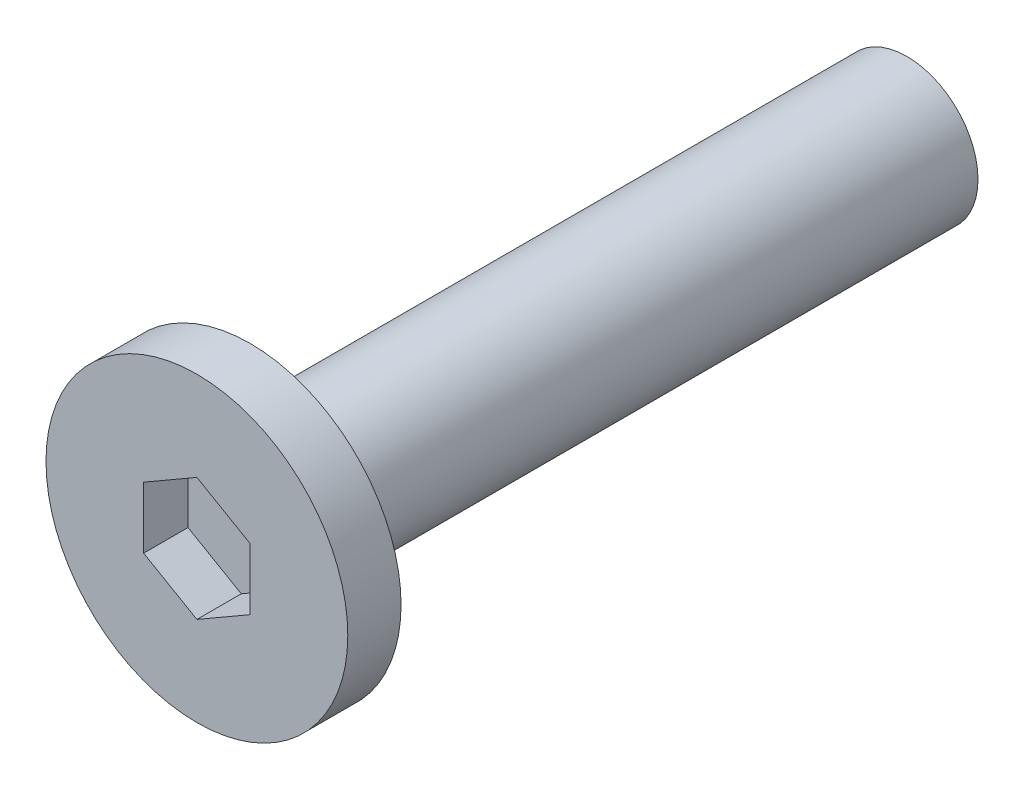
ISO-10303-21;
HEADER;
FILE_DESCRIPTION(('STEP AP214'),'2;1');
FILE_NAME('part.step','',(''),(''),'','','');
FILE_SCHEMA(('AUTOMOTIVE_DESIGN { 1 0 10303 214 1 1 1 1 }'));
ENDSEC;
DATA;
#1=APPLICATION_CONTEXT('core data for automotive mechanical design processes');
#2=APPLICATION_PROTOCOL_DEFINITION('international standard','automotive_design',2000,#1);
#3=PRODUCT_CONTEXT('',#1,'mechanical');
#4=PRODUCT('Part','Part','',(#3));
#5=PRODUCT_RELATED_PRODUCT_CATEGORY('part','',(#4));
#6=PRODUCT_DEFINITION_FORMATION('','',#4);
#7=PRODUCT_DEFINITION_CONTEXT('part definition',#1,'design');
#8=PRODUCT_DEFINITION('design','',#6,#7);
#9=PRODUCT_DEFINITION_SHAPE('','',#8);
#10=(LENGTH_UNIT() NAMED_UNIT(*) SI_UNIT(.MILLI.,.METRE.));
#11=(NAMED_UNIT(*) PLANE_ANGLE_UNIT() SI_UNIT($,.RADIAN.));
#12=(NAMED_UNIT(*) SI_UNIT($,.STERADIAN.) SOLID_ANGLE_UNIT());
#13=UNCERTAINTY_MEASURE_WITH_UNIT(LENGTH_MEASURE(1.E-05),#10,'distance_accuracy_value','');
#14=(GEOMETRIC_REPRESENTATION_CONTEXT(3) GLOBAL_UNCERTAINTY_ASSIGNED_CONTEXT((#13)) GLOBAL_UNIT_ASSIGNED_CONTEXT((#10,
#11,#12)) REPRESENTATION_CONTEXT('',''));
#15=CARTESIAN_POINT('',(0.,0.,0.));
#16=DIRECTION('',(0.,0.,1.));
#17=DIRECTION('',(1.,0.,0.));
#18=AXIS2_PLACEMENT_3D('',#15,#16,#17);
#19=CARTESIAN_POINT('',(86.6025403784436,-143.95,369.174757541019));
#20=DIRECTION('',(0.,0.,1.));
#21=DIRECTION('',(1.,0.,0.));
#22=AXIS2_PLACEMENT_3D('',#19,#20,#21);
#23=PLANE('',#22);
#24=CARTESIAN_POINT('',(86.6025403784436,-143.95,369.174757541019));
#25=DIRECTION('',(0.,0.,1.));
#26=DIRECTION('',(-1.,0.,0.));
#27=AXIS2_PLACEMENT_3D('',#24,#25,#26);
#28=CIRCLE('',#27,1.5);
#29=CARTESIAN_POINT('',(85.1025403784436,-143.95,369.174757541019));
#30=VERTEX_POINT('',#29);
#31=EDGE_CURVE('E11',#30,#30,#28,.T.);
#32=ORIENTED_EDGE('',*,*,#31,.F.);
#33=EDGE_LOOP('',(#32));
#34=FACE_BOUND('',#33,.T.);
#35=ADVANCED_FACE('F42',(#34),#23,.F.);
#36=CARTESIAN_POINT('',(86.6025403784436,-143.95,351.774757541019));
#37=DIRECTION('',(0.,0.,1.));
#38=DIRECTION('',(1.,0.,0.));
#39=AXIS2_PLACEMENT_3D('',#36,#37,#38);
#40=CYLINDRICAL_SURFACE('',#39,1.5);
#41=ORIENTED_EDGE('',*,*,#31,.T.);
#42=EDGE_LOOP('',(#41));
#43=FACE_BOUND('',#42,.T.);
#44=CARTESIAN_POINT('',(86.6025403784436,-143.95,351.474757541019));
#45=DIRECTION('',(0.,0.,1.));
#46=DIRECTION('',(1.,0.,0.));
#47=AXIS2_PLACEMENT_3D('',#44,#45,#46);
#48=CIRCLE('',#47,1.5);
#49=CARTESIAN_POINT('',(88.1025403784436,-143.95,351.474757541019));
#50=VERTEX_POINT('',#49);
#51=EDGE_CURVE('E53',#50,#50,#48,.T.);
#52=ORIENTED_EDGE('',*,*,#51,.F.);
#53=EDGE_LOOP('',(#52));
#54=FACE_BOUND('',#53,.T.);
#55=ADVANCED_FACE('F250',(#43,#54),#40,.F.);
#56=CARTESIAN_POINT('',(86.6025403784436,-143.95,351.474757541019));
#57=DIRECTION('',(0.,0.,-1.));
#58=DIRECTION('',(0.,-1.,0.));
#59=AXIS2_PLACEMENT_3D('',#56,#57,#58);
#60=PLANE('',#59);
#61=CARTESIAN_POINT('',(86.6025403784436,-143.95,351.474757541019));
#62=DIRECTION('',(0.,0.,1.));
#63=DIRECTION('',(1.,0.,0.));
#64=AXIS2_PLACEMENT_3D('',#61,#62,#63);
#65=CIRCLE('',#64,2.);
#66=CARTESIAN_POINT('',(88.6025403784436,-143.95,351.474757541019));
#67=VERTEX_POINT('',#66);
#68=EDGE_CURVE('E139',#67,#67,#65,.T.);
#69=ORIENTED_EDGE('',*,*,#68,.F.);
#70=EDGE_LOOP('',(#69));
#71=FACE_BOUND('',#70,.T.);
#72=ORIENTED_EDGE('',*,*,#51,.T.);
#73=EDGE_LOOP('',(#72));
#74=FACE_BOUND('',#73,.T.);
#75=ADVANCED_FACE('F255',(#71,#74),#60,.T.);
#76=CARTESIAN_POINT('',(-12.990381056767,-121.450000000002,370.224757541019));
#77=DIRECTION('',(0.,0.,1.));
#78=DIRECTION('',(1.,0.,0.));
#79=AXIS2_PLACEMENT_3D('',#76,#77,#78);
#80=PLANE('',#79);
#81=DIRECTION('',(0.866025403784439,0.5,0.));
#82=VECTOR('',#81,1.);
#83=CARTESIAN_POINT('',(20.9006350946104,-180.150961894325,370.224757541019));
#84=LINE('',#83,#82);
#85=CARTESIAN_POINT('',(85.1025403784435,-143.083974596217,370.224757541019));
#86=VERTEX_POINT('',#85);
#87=CARTESIAN_POINT('',(86.6025403784436,-142.217949192433,370.224757541019));
#88=VERTEX_POINT('',#87);
#89=EDGE_CURVE('E191',#86,#88,#84,.T.);
#90=ORIENTED_EDGE('',*,*,#89,.F.);
#91=DIRECTION('',(0.,1.,0.));
#92=VECTOR('',#91,1.);
#93=CARTESIAN_POINT('',(85.1025403784435,-121.450000000002,370.224757541019));
#94=LINE('',#93,#92);
#95=CARTESIAN_POINT('',(85.1025403784435,-144.816025403786,370.224757541019));
#96=VERTEX_POINT('',#95);
#97=EDGE_CURVE('E185',#96,#86,#94,.T.);
#98=ORIENTED_EDGE('',*,*,#97,.F.);
#99=DIRECTION('',(-0.866025403784439,0.5,0.));
#100=VECTOR('',#99,1.);
#101=CARTESIAN_POINT('',(1.41506350946074,-96.4990381056784,370.224757541019));
#102=LINE('',#101,#100);
#103=CARTESIAN_POINT('',(86.6025403784436,-145.682050807571,370.224757541019));
#104=VERTEX_POINT('',#103);
#105=EDGE_CURVE('E167',#104,#96,#102,.T.);
#106=ORIENTED_EDGE('',*,*,#105,.F.);
#107=DIRECTION('',(-0.866025403784439,-0.5,0.));
#108=VECTOR('',#107,1.);
#109=CARTESIAN_POINT('',(22.4006350946105,-182.749038105679,370.224757541019));
#110=LINE('',#109,#108);
#111=CARTESIAN_POINT('',(88.1025403784436,-144.816025403786,370.224757541019));
#112=VERTEX_POINT('',#111);
#113=EDGE_CURVE('E148',#112,#104,#110,.T.);
#114=ORIENTED_EDGE('',*,*,#113,.F.);
#115=DIRECTION('',(0.,-1.,0.));
#116=VECTOR('',#115,1.);
#117=CARTESIAN_POINT('',(88.1025403784436,-121.450000000002,370.224757541019));
#118=LINE('',#117,#116);
#119=CARTESIAN_POINT('',(88.1025403784436,-143.083974596217,370.224757541019));
#120=VERTEX_POINT('',#119);
#121=EDGE_CURVE('E147',#120,#112,#118,.T.);
#122=ORIENTED_EDGE('',*,*,#121,.F.);
#123=DIRECTION('',(0.866025403784439,-0.5,0.));
#124=VECTOR('',#123,1.);
#125=CARTESIAN_POINT('',(2.91506350946067,-93.9009618943254,370.224757541019));
#126=LINE('',#125,#124);
#127=EDGE_CURVE('E154',#88,#120,#126,.T.);
#128=ORIENTED_EDGE('',*,*,#127,.F.);
#129=EDGE_LOOP('',(#90,#98,#106,#114,#122,#128));
#130=FACE_BOUND('',#129,.T.);
#131=ADVANCED_FACE('F237',(#130),#80,.T.);
#132=CARTESIAN_POINT('',(87.9775403784436,-143.011805812569,369.974757541019));
#133=DIRECTION('',(0.5,0.866025403784439,0.));
#134=DIRECTION('',(0.,0.,-1.));
#135=AXIS2_PLACEMENT_3D('',#132,#133,#134);
#136=PLANE('',#135);
#137=DIRECTION('',(-0.866025403784439,0.5,0.));
#138=VECTOR('',#137,1.);
#139=CARTESIAN_POINT('',(87.9775403784436,-143.011805812569,371.474757541018));
#140=LINE('',#139,#138);
#141=CARTESIAN_POINT('',(88.1025403784436,-143.083974596217,371.474757541018));
#142=VERTEX_POINT('',#141);
#143=CARTESIAN_POINT('',(86.6025403784436,-142.217949192433,371.474757541018));
#144=VERTEX_POINT('',#143);
#145=EDGE_CURVE('E46',#142,#144,#140,.T.);
#146=ORIENTED_EDGE('',*,*,#145,.T.);
#147=DIRECTION('',(0.,0.,-1.));
#148=VECTOR('',#147,1.);
#149=CARTESIAN_POINT('',(86.6025403784436,-142.217949192433,369.974757541019));
#150=LINE('',#149,#148);
#151=EDGE_CURVE('E186',#144,#88,#150,.T.);
#152=ORIENTED_EDGE('',*,*,#151,.T.);
#153=ORIENTED_EDGE('',*,*,#127,.T.);
#154=DIRECTION('',(0.,0.,-1.));
#155=VECTOR('',#154,1.);
#156=CARTESIAN_POINT('',(88.1025403784436,-143.083974596217,369.974757541019));
#157=LINE('',#156,#155);
#158=EDGE_CURVE('E145',#142,#120,#157,.T.);
#159=ORIENTED_EDGE('',*,*,#158,.F.);
#160=EDGE_LOOP('',(#146,#152,#153,#159));
#161=FACE_BOUND('',#160,.T.);
#162=ADVANCED_FACE('F230',(#161),#136,.F.);
#163=CARTESIAN_POINT('',(88.1025403784436,-144.671687836489,369.974757541019));
#164=DIRECTION('',(1.,0.,0.));
#165=DIRECTION('',(0.,1.,0.));
#166=AXIS2_PLACEMENT_3D('',#163,#164,#165);
#167=PLANE('',#166);
#168=DIRECTION('',(0.,1.,0.));
#169=VECTOR('',#168,1.);
#170=CARTESIAN_POINT('',(88.1025403784436,-144.671687836489,371.474757541018));
#171=LINE('',#170,#169);
#172=CARTESIAN_POINT('',(88.1025403784436,-144.816025403786,371.474757541018));
#173=VERTEX_POINT('',#172);
#174=EDGE_CURVE('E209',#173,#142,#171,.T.);
#175=ORIENTED_EDGE('',*,*,#174,.T.);
#176=ORIENTED_EDGE('',*,*,#158,.T.);
#177=ORIENTED_EDGE('',*,*,#121,.T.);
#178=DIRECTION('',(0.,0.,-1.));
#179=VECTOR('',#178,1.);
#180=CARTESIAN_POINT('',(88.1025403784436,-144.816025403786,369.974757541019));
#181=LINE('',#180,#179);
#182=EDGE_CURVE('E157',#173,#112,#181,.T.);
#183=ORIENTED_EDGE('',*,*,#182,.F.);
#184=EDGE_LOOP('',(#175,#176,#177,#183));
#185=FACE_BOUND('',#184,.T.);
#186=ADVANCED_FACE('F239',(#185),#167,.F.);
#187=CARTESIAN_POINT('',(86.7275403784436,-145.609882023922,369.974757541019));
#188=DIRECTION('',(0.5,-0.866025403784439,0.));
#189=DIRECTION('',(0.,0.,-1.));
#190=AXIS2_PLACEMENT_3D('',#187,#188,#189);
#191=PLANE('',#190);
#192=DIRECTION('',(0.866025403784439,0.5,0.));
#193=VECTOR('',#192,1.);
#194=CARTESIAN_POINT('',(86.7275403784436,-145.609882023922,371.474757541018));
#195=LINE('',#194,#193);
#196=CARTESIAN_POINT('',(86.6025403784436,-145.682050807571,371.474757541018));
#197=VERTEX_POINT('',#196);
#198=EDGE_CURVE('E175',#197,#173,#195,.T.);
#199=ORIENTED_EDGE('',*,*,#198,.T.);
#200=ORIENTED_EDGE('',*,*,#182,.T.);
#201=ORIENTED_EDGE('',*,*,#113,.T.);
#202=DIRECTION('',(0.,0.,-1.));
#203=VECTOR('',#202,1.);
#204=CARTESIAN_POINT('',(86.6025403784436,-145.682050807571,369.974757541019));
#205=LINE('',#204,#203);
#206=EDGE_CURVE('E171',#197,#104,#205,.T.);
#207=ORIENTED_EDGE('',*,*,#206,.F.);
#208=EDGE_LOOP('',(#199,#200,#201,#207));
#209=FACE_BOUND('',#208,.T.);
#210=ADVANCED_FACE('F44',(#209),#191,.F.);
#211=CARTESIAN_POINT('',(85.2275403784435,-144.888194187435,369.974757541019));
#212=DIRECTION('',(-0.5,-0.866025403784439,0.));
#213=DIRECTION('',(-0.866025403784439,0.5,0.));
#214=AXIS2_PLACEMENT_3D('',#211,#212,#213);
#215=PLANE('',#214);
#216=DIRECTION('',(0.866025403784439,-0.5,0.));
#217=VECTOR('',#216,1.);
#218=CARTESIAN_POINT('',(85.2275403784435,-144.888194187435,371.474757541018));
#219=LINE('',#218,#217);
#220=CARTESIAN_POINT('',(85.1025403784435,-144.816025403786,371.474757541018));
#221=VERTEX_POINT('',#220);
#222=EDGE_CURVE('E172',#221,#197,#219,.T.);
#223=ORIENTED_EDGE('',*,*,#222,.T.);
#224=ORIENTED_EDGE('',*,*,#206,.T.);
#225=ORIENTED_EDGE('',*,*,#105,.T.);
#226=DIRECTION('',(0.,0.,-1.));
#227=VECTOR('',#226,1.);
#228=CARTESIAN_POINT('',(85.1025403784435,-144.816025403786,369.974757541019));
#229=LINE('',#228,#227);
#230=EDGE_CURVE('E181',#221,#96,#229,.T.);
#231=ORIENTED_EDGE('',*,*,#230,.F.);
#232=EDGE_LOOP('',(#223,#224,#225,#231));
#233=FACE_BOUND('',#232,.T.);
#234=ADVANCED_FACE('F216',(#233),#215,.F.);
#235=CARTESIAN_POINT('',(85.1025403784435,-143.228312163515,369.974757541019));
#236=DIRECTION('',(-1.,0.,0.));
#237=DIRECTION('',(0.,0.,1.));
#238=AXIS2_PLACEMENT_3D('',#235,#236,#237);
#239=PLANE('',#238);
#240=DIRECTION('',(0.,-1.,0.));
#241=VECTOR('',#240,1.);
#242=CARTESIAN_POINT('',(85.1025403784435,-143.228312163515,371.474757541018));
#243=LINE('',#242,#241);
#244=CARTESIAN_POINT('',(85.1025403784435,-143.083974596217,371.474757541018));
#245=VERTEX_POINT('',#244);
#246=EDGE_CURVE('E174',#245,#221,#243,.T.);
#247=ORIENTED_EDGE('',*,*,#246,.T.);
#248=ORIENTED_EDGE('',*,*,#230,.T.);
#249=ORIENTED_EDGE('',*,*,#97,.T.);
#250=DIRECTION('',(0.,0.,-1.));
#251=VECTOR('',#250,1.);
#252=CARTESIAN_POINT('',(85.1025403784435,-143.083974596217,369.974757541019));
#253=LINE('',#252,#251);
#254=EDGE_CURVE('E144',#245,#86,#253,.T.);
#255=ORIENTED_EDGE('',*,*,#254,.F.);
#256=EDGE_LOOP('',(#247,#248,#249,#255));
#257=FACE_BOUND('',#256,.T.);
#258=ADVANCED_FACE('F258',(#257),#239,.F.);
#259=CARTESIAN_POINT('',(86.4775403784435,-142.290117976081,369.974757541019));
#260=DIRECTION('',(-0.5,0.866025403784439,0.));
#261=DIRECTION('',(0.,0.,1.));
#262=AXIS2_PLACEMENT_3D('',#259,#260,#261);
#263=PLANE('',#262);
#264=DIRECTION('',(-0.866025403784439,-0.5,0.));
#265=VECTOR('',#264,1.);
#266=CARTESIAN_POINT('',(86.4775403784435,-142.290117976081,371.474757541018));
#267=LINE('',#266,#265);
#268=EDGE_CURVE('E177',#144,#245,#267,.T.);
#269=ORIENTED_EDGE('',*,*,#268,.T.);
#270=ORIENTED_EDGE('',*,*,#254,.T.);
#271=ORIENTED_EDGE('',*,*,#89,.T.);
#272=ORIENTED_EDGE('',*,*,#151,.F.);
#273=EDGE_LOOP('',(#269,#270,#271,#272));
#274=FACE_BOUND('',#273,.T.);
#275=ADVANCED_FACE('F234',(#274),#263,.F.);
#276=CARTESIAN_POINT('',(86.6025403784436,-143.95,371.474757541018));
#277=DIRECTION('',(0.,0.,1.));
#278=DIRECTION('',(1.,0.,0.));
#279=AXIS2_PLACEMENT_3D('',#276,#277,#278);
#280=PLANE('',#279);
#281=ORIENTED_EDGE('',*,*,#268,.F.);
#282=ORIENTED_EDGE('',*,*,#145,.F.);
#283=ORIENTED_EDGE('',*,*,#174,.F.);
#284=ORIENTED_EDGE('',*,*,#198,.F.);
#285=ORIENTED_EDGE('',*,*,#222,.F.);
#286=ORIENTED_EDGE('',*,*,#246,.F.);
#287=EDGE_LOOP('',(#281,#282,#283,#284,#285,#286));
#288=FACE_BOUND('',#287,.T.);
#289=CARTESIAN_POINT('',(86.6025403784436,-143.95,371.474757541018));
#290=DIRECTION('',(0.,0.,1.));
#291=DIRECTION('',(-1.,0.,0.));
#292=AXIS2_PLACEMENT_3D('',#289,#290,#291);
#293=CIRCLE('',#292,4.25);
#294=CARTESIAN_POINT('',(82.3525403784436,-143.95,371.474757541018));
#295=VERTEX_POINT('',#294);
#296=EDGE_CURVE('E128',#295,#295,#293,.T.);
#297=ORIENTED_EDGE('',*,*,#296,.T.);
#298=EDGE_LOOP('',(#297));
#299=FACE_BOUND('',#298,.T.);
#300=ADVANCED_FACE('F129',(#288,#299),#280,.T.);
#301=CARTESIAN_POINT('',(86.6025403784436,-143.95,369.974757541019));
#302=DIRECTION('',(0.,0.,1.));
#303=DIRECTION('',(1.,0.,0.));
#304=AXIS2_PLACEMENT_3D('',#301,#302,#303);
#305=PLANE('',#304);
#306=CARTESIAN_POINT('',(86.6025403784436,-143.95,369.974757541019));
#307=DIRECTION('',(0.,0.,-1.));
#308=DIRECTION('',(-1.,0.,0.));
#309=AXIS2_PLACEMENT_3D('',#306,#307,#308);
#310=CIRCLE('',#309,4.25);
#311=CARTESIAN_POINT('',(82.3525403784436,-143.95,369.974757541019));
#312=VERTEX_POINT('',#311);
#313=EDGE_CURVE('E133',#312,#312,#310,.T.);
#314=ORIENTED_EDGE('',*,*,#313,.T.);
#315=EDGE_LOOP('',(#314));
#316=FACE_BOUND('',#315,.T.);
#317=CARTESIAN_POINT('',(86.6025403784436,-143.95,369.974757541019));
#318=DIRECTION('',(0.,0.,-1.));
#319=DIRECTION('',(-1.,0.,0.));
#320=AXIS2_PLACEMENT_3D('',#317,#318,#319);
#321=CIRCLE('',#320,2.);
#322=CARTESIAN_POINT('',(84.6025403784436,-143.95,369.974757541019));
#323=VERTEX_POINT('',#322);
#324=EDGE_CURVE('E132',#323,#323,#321,.T.);
#325=ORIENTED_EDGE('',*,*,#324,.F.);
#326=EDGE_LOOP('',(#325));
#327=FACE_BOUND('',#326,.T.);
#328=ADVANCED_FACE('F267',(#316,#327),#305,.F.);
#329=CARTESIAN_POINT('',(86.6025403784436,-143.95,370.974757541019));
#330=DIRECTION('',(0.,0.,-1.));
#331=DIRECTION('',(-1.,0.,0.));
#332=AXIS2_PLACEMENT_3D('',#329,#330,#331);
#333=CYLINDRICAL_SURFACE('',#332,2.);
#334=ORIENTED_EDGE('',*,*,#68,.T.);
#335=EDGE_LOOP('',(#334));
#336=FACE_BOUND('',#335,.T.);
#337=ORIENTED_EDGE('',*,*,#324,.T.);
#338=EDGE_LOOP('',(#337));
#339=FACE_BOUND('',#338,.T.);
#340=ADVANCED_FACE('F269',(#336,#339),#333,.T.);
#341=CARTESIAN_POINT('',(86.6025403784436,-143.95,348.174757541018));
#342=DIRECTION('',(0.,0.,1.));
#343=DIRECTION('',(1.,0.,0.));
#344=AXIS2_PLACEMENT_3D('',#341,#342,#343);
#345=CYLINDRICAL_SURFACE('',#344,4.25);
#346=ORIENTED_EDGE('',*,*,#296,.F.);
#347=EDGE_LOOP('',(#346));
#348=FACE_BOUND('',#347,.T.);
#349=ORIENTED_EDGE('',*,*,#313,.F.);
#350=EDGE_LOOP('',(#349));
#351=FACE_BOUND('',#350,.T.);
#352=ADVANCED_FACE('F273',(#348,#351),#345,.T.);
#353=CLOSED_SHELL('',(#35,#55,#75,#131,#162,#186,#210,#234,#258,#275,#300,#328,#340,#352));
#354=MANIFOLD_SOLID_BREP('B2',#353);
#355=ADVANCED_BREP_SHAPE_REPRESENTATION('',(#18,#354),#14);
#356=SHAPE_DEFINITION_REPRESENTATION(#9,#355);
ENDSEC;
END-ISO-10303-21;
